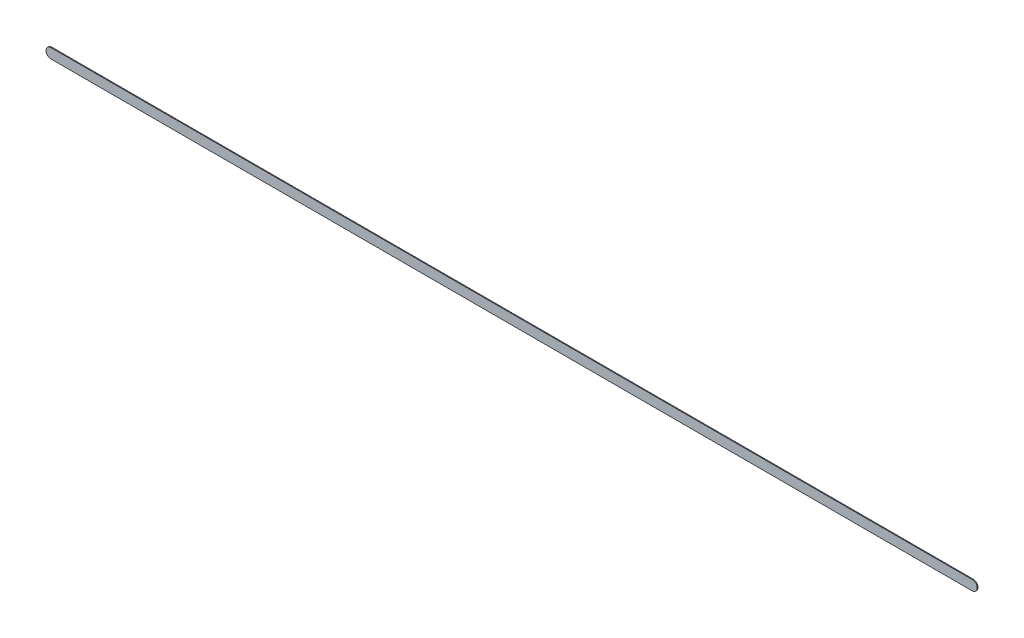
ISO-10303-21;
HEADER;
FILE_DESCRIPTION(('STEP AP214'),'2;1');
FILE_NAME('part.step','',(''),(''),'','','');
FILE_SCHEMA(('AUTOMOTIVE_DESIGN { 1 0 10303 214 1 1 1 1 }'));
ENDSEC;
DATA;
#1=APPLICATION_CONTEXT('core data for automotive mechanical design processes');
#2=APPLICATION_PROTOCOL_DEFINITION('international standard','automotive_design',2000,#1);
#3=PRODUCT_CONTEXT('',#1,'mechanical');
#4=PRODUCT('Part','Part','',(#3));
#5=PRODUCT_RELATED_PRODUCT_CATEGORY('part','',(#4));
#6=PRODUCT_DEFINITION_FORMATION('','',#4);
#7=PRODUCT_DEFINITION_CONTEXT('part definition',#1,'design');
#8=PRODUCT_DEFINITION('design','',#6,#7);
#9=PRODUCT_DEFINITION_SHAPE('','',#8);
#10=(LENGTH_UNIT() NAMED_UNIT(*) SI_UNIT(.MILLI.,.METRE.));
#11=(NAMED_UNIT(*) PLANE_ANGLE_UNIT() SI_UNIT($,.RADIAN.));
#12=(NAMED_UNIT(*) SI_UNIT($,.STERADIAN.) SOLID_ANGLE_UNIT());
#13=UNCERTAINTY_MEASURE_WITH_UNIT(LENGTH_MEASURE(1.E-05),#10,'distance_accuracy_value','');
#14=(GEOMETRIC_REPRESENTATION_CONTEXT(3) GLOBAL_UNCERTAINTY_ASSIGNED_CONTEXT((#13)) GLOBAL_UNIT_ASSIGNED_CONTEXT((#10,
#11,#12)) REPRESENTATION_CONTEXT('',''));
#15=CARTESIAN_POINT('',(0.,0.,0.));
#16=DIRECTION('',(0.,0.,1.));
#17=DIRECTION('',(1.,0.,0.));
#18=AXIS2_PLACEMENT_3D('',#15,#16,#17);
#19=CARTESIAN_POINT('',(27.375,55.1625,1.1723000001));
#20=DIRECTION('',(0.,0.,1.));
#21=DIRECTION('',(1.,0.,0.));
#22=AXIS2_PLACEMENT_3D('',#19,#20,#21);
#23=PLANE('',#22);
#24=CARTESIAN_POINT('',(20.375,55.1625,1.1723000001));
#25=DIRECTION('',(0.,0.,-1.));
#26=DIRECTION('',(1.,0.,0.));
#27=AXIS2_PLACEMENT_3D('',#24,#25,#26);
#28=CIRCLE('',#27,0.075);
#29=CARTESIAN_POINT('',(20.375,55.0875,1.1723000001));
#30=VERTEX_POINT('',#29);
#31=CARTESIAN_POINT('',(20.375,55.2375,1.1723000001));
#32=VERTEX_POINT('',#31);
#33=EDGE_CURVE('E128',#30,#32,#28,.T.);
#34=ORIENTED_EDGE('',*,*,#33,.F.);
#35=DIRECTION('',(1.,0.,0.));
#36=VECTOR('',#35,1.);
#37=CARTESIAN_POINT('',(34.375,55.0875,1.1723000001));
#38=LINE('',#37,#36);
#39=CARTESIAN_POINT('',(34.375,55.0875,1.1723000001));
#40=VERTEX_POINT('',#39);
#41=EDGE_CURVE('E116',#30,#40,#38,.T.);
#42=ORIENTED_EDGE('',*,*,#41,.T.);
#43=CARTESIAN_POINT('',(34.375,55.1625,1.1723000001));
#44=DIRECTION('',(0.,0.,1.));
#45=DIRECTION('',(1.,0.,0.));
#46=AXIS2_PLACEMENT_3D('',#43,#44,#45);
#47=CIRCLE('',#46,0.075);
#48=CARTESIAN_POINT('',(34.45,55.1625,1.1723000001));
#49=VERTEX_POINT('',#48);
#50=EDGE_CURVE('E97',#40,#49,#47,.T.);
#51=ORIENTED_EDGE('',*,*,#50,.T.);
#52=CARTESIAN_POINT('',(34.375,55.1625,1.1723000001));
#53=DIRECTION('',(0.,0.,1.));
#54=DIRECTION('',(1.,0.,0.));
#55=AXIS2_PLACEMENT_3D('',#52,#53,#54);
#56=CIRCLE('',#55,0.075);
#57=CARTESIAN_POINT('',(34.375,55.2375,1.1723000001));
#58=VERTEX_POINT('',#57);
#59=EDGE_CURVE('E92',#49,#58,#56,.T.);
#60=ORIENTED_EDGE('',*,*,#59,.T.);
#61=DIRECTION('',(-1.,0.,0.));
#62=VECTOR('',#61,1.);
#63=CARTESIAN_POINT('',(20.375,55.2375,1.1723000001));
#64=LINE('',#63,#62);
#65=EDGE_CURVE('E11',#58,#32,#64,.T.);
#66=ORIENTED_EDGE('',*,*,#65,.T.);
#67=EDGE_LOOP('',(#34,#42,#51,#60,#66));
#68=FACE_BOUND('',#67,.T.);
#69=ADVANCED_FACE('F17',(#68),#23,.T.);
#70=CARTESIAN_POINT('',(20.375,55.2375,1.1596000001));
#71=DIRECTION('',(0.,-1.,0.));
#72=DIRECTION('',(0.,0.,-1.));
#73=AXIS2_PLACEMENT_3D('',#70,#71,#72);
#74=PLANE('',#73);
#75=DIRECTION('',(0.,0.,1.));
#76=VECTOR('',#75,1.);
#77=CARTESIAN_POINT('',(34.375,55.2375,1.1596000001));
#78=LINE('',#77,#76);
#79=CARTESIAN_POINT('',(34.375,55.2375,1.1596000001));
#80=VERTEX_POINT('',#79);
#81=EDGE_CURVE('E88',#80,#58,#78,.T.);
#82=ORIENTED_EDGE('',*,*,#81,.F.);
#83=DIRECTION('',(-1.,0.,0.));
#84=VECTOR('',#83,1.);
#85=CARTESIAN_POINT('',(27.375,55.2375,1.1596000001));
#86=LINE('',#85,#84);
#87=CARTESIAN_POINT('',(20.375,55.2375,1.1596000001));
#88=VERTEX_POINT('',#87);
#89=EDGE_CURVE('E84',#80,#88,#86,.T.);
#90=ORIENTED_EDGE('',*,*,#89,.T.);
#91=DIRECTION('',(0.,0.,-1.));
#92=VECTOR('',#91,1.);
#93=CARTESIAN_POINT('',(20.375,55.2375,1.1596000001));
#94=LINE('',#93,#92);
#95=EDGE_CURVE('E28',#32,#88,#94,.T.);
#96=ORIENTED_EDGE('',*,*,#95,.F.);
#97=ORIENTED_EDGE('',*,*,#65,.F.);
#98=EDGE_LOOP('',(#82,#90,#96,#97));
#99=FACE_BOUND('',#98,.T.);
#100=ADVANCED_FACE('F154',(#99),#74,.F.);
#101=CARTESIAN_POINT('',(20.375,55.1625,1.1596000001));
#102=DIRECTION('',(0.,0.,1.));
#103=DIRECTION('',(1.,0.,0.));
#104=AXIS2_PLACEMENT_3D('',#101,#102,#103);
#105=CYLINDRICAL_SURFACE('',#104,0.075);
#106=CARTESIAN_POINT('',(20.375,55.1625,1.1596000001));
#107=DIRECTION('',(0.,0.,1.));
#108=DIRECTION('',(1.,0.,0.));
#109=AXIS2_PLACEMENT_3D('',#106,#107,#108);
#110=CIRCLE('',#109,0.075);
#111=CARTESIAN_POINT('',(20.375,55.0875,1.1596000001));
#112=VERTEX_POINT('',#111);
#113=EDGE_CURVE('E107',#88,#112,#110,.T.);
#114=ORIENTED_EDGE('',*,*,#113,.T.);
#115=DIRECTION('',(0.,0.,1.));
#116=VECTOR('',#115,1.);
#117=CARTESIAN_POINT('',(20.375,55.0875,1.1596000001));
#118=LINE('',#117,#116);
#119=EDGE_CURVE('E112',#112,#30,#118,.T.);
#120=ORIENTED_EDGE('',*,*,#119,.T.);
#121=ORIENTED_EDGE('',*,*,#33,.T.);
#122=ORIENTED_EDGE('',*,*,#95,.T.);
#123=EDGE_LOOP('',(#114,#120,#121,#122));
#124=FACE_BOUND('',#123,.T.);
#125=ADVANCED_FACE('F19',(#124),#105,.T.);
#126=CARTESIAN_POINT('',(34.375,55.0875,1.1596000001));
#127=DIRECTION('',(0.,1.,0.));
#128=DIRECTION('',(1.,0.,0.));
#129=AXIS2_PLACEMENT_3D('',#126,#127,#128);
#130=PLANE('',#129);
#131=ORIENTED_EDGE('',*,*,#119,.F.);
#132=DIRECTION('',(1.,0.,0.));
#133=VECTOR('',#132,1.);
#134=CARTESIAN_POINT('',(27.375,55.0875,1.1596000001));
#135=LINE('',#134,#133);
#136=CARTESIAN_POINT('',(34.375,55.0875,1.1596000001));
#137=VERTEX_POINT('',#136);
#138=EDGE_CURVE('E69',#112,#137,#135,.T.);
#139=ORIENTED_EDGE('',*,*,#138,.T.);
#140=DIRECTION('',(0.,0.,-1.));
#141=VECTOR('',#140,1.);
#142=CARTESIAN_POINT('',(34.375,55.0875,1.1596000001));
#143=LINE('',#142,#141);
#144=EDGE_CURVE('E100',#40,#137,#143,.T.);
#145=ORIENTED_EDGE('',*,*,#144,.F.);
#146=ORIENTED_EDGE('',*,*,#41,.F.);
#147=EDGE_LOOP('',(#131,#139,#145,#146));
#148=FACE_BOUND('',#147,.T.);
#149=ADVANCED_FACE('F142',(#148),#130,.F.);
#150=CARTESIAN_POINT('',(34.375,55.1625,1.1596000001));
#151=DIRECTION('',(0.,0.,1.));
#152=DIRECTION('',(1.,0.,0.));
#153=AXIS2_PLACEMENT_3D('',#150,#151,#152);
#154=CYLINDRICAL_SURFACE('',#153,0.075);
#155=DIRECTION('',(0.,0.,1.));
#156=VECTOR('',#155,1.);
#157=CARTESIAN_POINT('',(34.45,55.1625,1.1596000001));
#158=LINE('',#157,#156);
#159=CARTESIAN_POINT('',(34.45,55.1625,1.1596000001));
#160=VERTEX_POINT('',#159);
#161=EDGE_CURVE('E90',#160,#49,#158,.T.);
#162=ORIENTED_EDGE('',*,*,#161,.F.);
#163=CARTESIAN_POINT('',(34.375,55.1625,1.1596000001));
#164=DIRECTION('',(0.,0.,1.));
#165=DIRECTION('',(1.,0.,0.));
#166=AXIS2_PLACEMENT_3D('',#163,#164,#165);
#167=CIRCLE('',#166,0.075);
#168=EDGE_CURVE('E21',#160,#80,#167,.T.);
#169=ORIENTED_EDGE('',*,*,#168,.T.);
#170=ORIENTED_EDGE('',*,*,#81,.T.);
#171=ORIENTED_EDGE('',*,*,#59,.F.);
#172=EDGE_LOOP('',(#162,#169,#170,#171));
#173=FACE_BOUND('',#172,.T.);
#174=ADVANCED_FACE('F91',(#173),#154,.T.);
#175=CARTESIAN_POINT('',(27.375,55.1625,1.1596000001));
#176=DIRECTION('',(0.,0.,1.));
#177=DIRECTION('',(1.,0.,0.));
#178=AXIS2_PLACEMENT_3D('',#175,#176,#177);
#179=PLANE('',#178);
#180=ORIENTED_EDGE('',*,*,#138,.F.);
#181=ORIENTED_EDGE('',*,*,#113,.F.);
#182=ORIENTED_EDGE('',*,*,#89,.F.);
#183=ORIENTED_EDGE('',*,*,#168,.F.);
#184=CARTESIAN_POINT('',(34.375,55.1625,1.1596000001));
#185=DIRECTION('',(0.,0.,1.));
#186=DIRECTION('',(1.,0.,0.));
#187=AXIS2_PLACEMENT_3D('',#184,#185,#186);
#188=CIRCLE('',#187,0.075);
#189=EDGE_CURVE('E81',#137,#160,#188,.T.);
#190=ORIENTED_EDGE('',*,*,#189,.F.);
#191=EDGE_LOOP('',(#180,#181,#182,#183,#190));
#192=FACE_BOUND('',#191,.T.);
#193=ADVANCED_FACE('F79',(#192),#179,.F.);
#194=CARTESIAN_POINT('',(34.375,55.1625,1.1596000001));
#195=DIRECTION('',(0.,0.,1.));
#196=DIRECTION('',(1.,0.,0.));
#197=AXIS2_PLACEMENT_3D('',#194,#195,#196);
#198=CYLINDRICAL_SURFACE('',#197,0.075);
#199=ORIENTED_EDGE('',*,*,#189,.T.);
#200=ORIENTED_EDGE('',*,*,#161,.T.);
#201=ORIENTED_EDGE('',*,*,#50,.F.);
#202=ORIENTED_EDGE('',*,*,#144,.T.);
#203=EDGE_LOOP('',(#199,#200,#201,#202));
#204=FACE_BOUND('',#203,.T.);
#205=ADVANCED_FACE('F99',(#204),#198,.T.);
#206=CLOSED_SHELL('',(#69,#100,#125,#149,#174,#193,#205));
#207=MANIFOLD_SOLID_BREP('B1',#206);
#208=ADVANCED_BREP_SHAPE_REPRESENTATION('',(#18,#207),#14);
#209=SHAPE_DEFINITION_REPRESENTATION(#9,#208);
ENDSEC;
END-ISO-10303-21;
